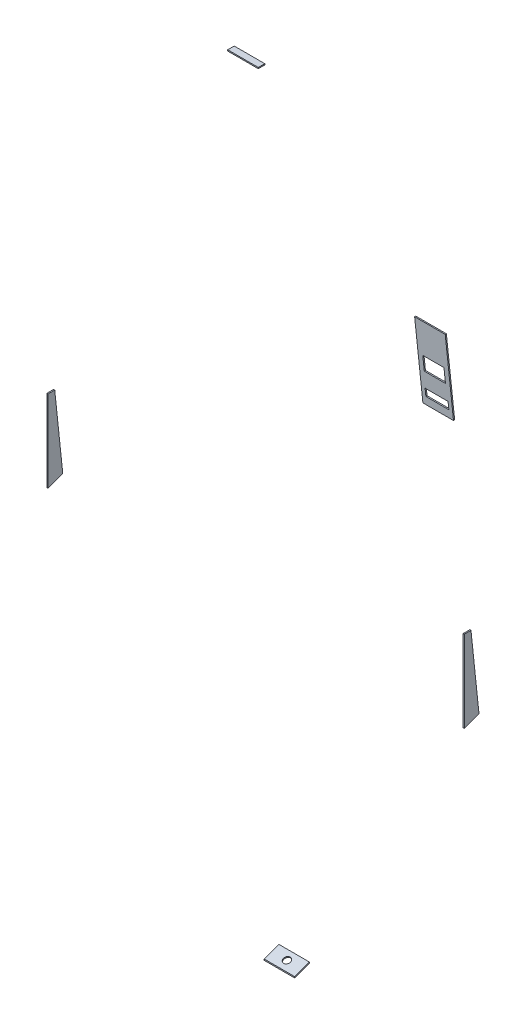
ISO-10303-21;
HEADER;
FILE_DESCRIPTION(('STEP AP214'),'2;1');
FILE_NAME('part.step','',(''),(''),'','','');
FILE_SCHEMA(('AUTOMOTIVE_DESIGN { 1 0 10303 214 1 1 1 1 }'));
ENDSEC;
DATA;
#1=APPLICATION_CONTEXT('core data for automotive mechanical design processes');
#2=APPLICATION_PROTOCOL_DEFINITION('international standard','automotive_design',2000,#1);
#3=PRODUCT_CONTEXT('',#1,'mechanical');
#4=PRODUCT('Part','Part','',(#3));
#5=PRODUCT_RELATED_PRODUCT_CATEGORY('part','',(#4));
#6=PRODUCT_DEFINITION_FORMATION('','',#4);
#7=PRODUCT_DEFINITION_CONTEXT('part definition',#1,'design');
#8=PRODUCT_DEFINITION('design','',#6,#7);
#9=PRODUCT_DEFINITION_SHAPE('','',#8);
#10=(LENGTH_UNIT() NAMED_UNIT(*) SI_UNIT(.MILLI.,.METRE.));
#11=(NAMED_UNIT(*) PLANE_ANGLE_UNIT() SI_UNIT($,.RADIAN.));
#12=(NAMED_UNIT(*) SI_UNIT($,.STERADIAN.) SOLID_ANGLE_UNIT());
#13=UNCERTAINTY_MEASURE_WITH_UNIT(LENGTH_MEASURE(1.E-05),#10,'distance_accuracy_value','');
#14=(GEOMETRIC_REPRESENTATION_CONTEXT(3) GLOBAL_UNCERTAINTY_ASSIGNED_CONTEXT((#13)) GLOBAL_UNIT_ASSIGNED_CONTEXT((#10,
#11,#12)) REPRESENTATION_CONTEXT('',''));
#15=CARTESIAN_POINT('',(0.,0.,0.));
#16=DIRECTION('',(0.,0.,1.));
#17=DIRECTION('',(1.,0.,0.));
#18=AXIS2_PLACEMENT_3D('',#15,#16,#17);
#19=CARTESIAN_POINT('',(62.794533111807,-6485.15366247084,-290.398414051492));
#20=DIRECTION('',(0.,0.939607059285866,0.342255130188236));
#21=DIRECTION('',(0.,-0.342255130188236,0.939607059285866));
#22=AXIS2_PLACEMENT_3D('',#19,#20,#21);
#23=PLANE('',#22);
#24=DIRECTION('',(0.,-0.342255130188232,0.939607059285868));
#25=VECTOR('',#24,1.);
#26=CARTESIAN_POINT('',(61.294533111807,-6485.15366247084,-290.398414051492));
#27=LINE('',#26,#25);
#28=CARTESIAN_POINT('',(61.294533111807,-6560.22169189386,-84.3110711568758));
#29=VERTEX_POINT('',#28);
#30=CARTESIAN_POINT('',(61.294533111807,-6567.19794008991,-65.1588905928039));
#31=VERTEX_POINT('',#30);
#32=EDGE_CURVE('E77',#29,#31,#27,.T.);
#33=ORIENTED_EDGE('',*,*,#32,.F.);
#34=DIRECTION('',(-1.,0.,0.));
#35=VECTOR('',#34,1.);
#36=CARTESIAN_POINT('',(62.794533111807,-6560.22169189386,-84.3110711568759));
#37=LINE('',#36,#35);
#38=CARTESIAN_POINT('',(62.794533111807,-6560.22169189386,-84.3110711568758));
#39=VERTEX_POINT('',#38);
#40=EDGE_CURVE('E85',#39,#29,#37,.T.);
#41=ORIENTED_EDGE('',*,*,#40,.F.);
#42=DIRECTION('',(0.,0.342255130188236,-0.939607059285866));
#43=VECTOR('',#42,1.);
#44=CARTESIAN_POINT('',(62.794533111807,-6485.15366247084,-290.398414051494));
#45=LINE('',#44,#43);
#46=CARTESIAN_POINT('',(62.794533111807,-6567.19794008991,-65.1588905928039));
#47=VERTEX_POINT('',#46);
#48=EDGE_CURVE('E177',#47,#39,#45,.T.);
#49=ORIENTED_EDGE('',*,*,#48,.F.);
#50=DIRECTION('',(1.,0.,0.));
#51=VECTOR('',#50,1.);
#52=CARTESIAN_POINT('',(62.794533111807,-6567.19794008991,-65.1588905928039));
#53=LINE('',#52,#51);
#54=EDGE_CURVE('E92',#31,#47,#53,.T.);
#55=ORIENTED_EDGE('',*,*,#54,.F.);
#56=EDGE_LOOP('',(#33,#41,#49,#55));
#57=FACE_BOUND('',#56,.T.);
#58=ADVANCED_FACE('F67',(#57),#23,.F.);
#59=CARTESIAN_POINT('',(62.794533111807,-6460.29435210617,-65.1588905928039));
#60=DIRECTION('',(0.,-1.,0.));
#61=DIRECTION('',(0.,0.,-1.));
#62=AXIS2_PLACEMENT_3D('',#59,#60,#61);
#63=PLANE('',#62);
#64=DIRECTION('',(0.,0.,1.));
#65=VECTOR('',#64,1.);
#66=CARTESIAN_POINT('',(61.294533111807,-6460.29435210617,-65.1588905928039));
#67=LINE('',#66,#65);
#68=CARTESIAN_POINT('',(61.294533111807,-6460.29435210617,-73.8082845263572));
#69=VERTEX_POINT('',#68);
#70=CARTESIAN_POINT('',(61.294533111807,-6460.29435210617,-65.1588905928039));
#71=VERTEX_POINT('',#70);
#72=EDGE_CURVE('E117',#69,#71,#67,.T.);
#73=ORIENTED_EDGE('',*,*,#72,.T.);
#74=DIRECTION('',(-1.,0.,0.));
#75=VECTOR('',#74,1.);
#76=CARTESIAN_POINT('',(62.794533111807,-6460.29435210617,-65.1588905928039));
#77=LINE('',#76,#75);
#78=CARTESIAN_POINT('',(62.794533111807,-6460.29435210617,-65.1588905928039));
#79=VERTEX_POINT('',#78);
#80=EDGE_CURVE('E174',#79,#71,#77,.T.);
#81=ORIENTED_EDGE('',*,*,#80,.F.);
#82=DIRECTION('',(0.,0.,1.));
#83=VECTOR('',#82,1.);
#84=CARTESIAN_POINT('',(62.794533111807,-6460.29435210617,-65.1588905928013));
#85=LINE('',#84,#83);
#86=CARTESIAN_POINT('',(62.794533111807,-6460.29435210617,-73.8082845263571));
#87=VERTEX_POINT('',#86);
#88=EDGE_CURVE('E119',#87,#79,#85,.T.);
#89=ORIENTED_EDGE('',*,*,#88,.F.);
#90=DIRECTION('',(1.,0.,0.));
#91=VECTOR('',#90,1.);
#92=CARTESIAN_POINT('',(62.794533111807,-6460.29435210617,-73.8082845263571));
#93=LINE('',#92,#91);
#94=EDGE_CURVE('E113',#69,#87,#93,.T.);
#95=ORIENTED_EDGE('',*,*,#94,.F.);
#96=EDGE_LOOP('',(#73,#81,#89,#95));
#97=FACE_BOUND('',#96,.T.);
#98=ADVANCED_FACE('F115',(#97),#63,.F.);
#99=CARTESIAN_POINT('',(62.794533111807,-5872.37989652977,-12.0159852713637));
#100=DIRECTION('',(0.,-0.104528463267654,0.994521895368273));
#101=DIRECTION('',(0.,-0.994521895368273,-0.104528463267654));
#102=AXIS2_PLACEMENT_3D('',#99,#100,#101);
#103=PLANE('',#102);
#104=DIRECTION('',(0.,0.994521895368273,0.104528463267654));
#105=VECTOR('',#104,1.);
#106=CARTESIAN_POINT('',(62.7945331118069,-5872.37989652977,-12.0159852713637));
#107=LINE('',#106,#105);
#108=EDGE_CURVE('E128',#39,#87,#107,.T.);
#109=ORIENTED_EDGE('',*,*,#108,.F.);
#110=ORIENTED_EDGE('',*,*,#40,.T.);
#111=DIRECTION('',(0.,-0.994521895368273,-0.104528463267654));
#112=VECTOR('',#111,1.);
#113=CARTESIAN_POINT('',(61.2945331118069,-5872.37989652977,-12.0159852713637));
#114=LINE('',#113,#112);
#115=EDGE_CURVE('E14',#69,#29,#114,.T.);
#116=ORIENTED_EDGE('',*,*,#115,.F.);
#117=ORIENTED_EDGE('',*,*,#94,.T.);
#118=EDGE_LOOP('',(#109,#110,#116,#117));
#119=FACE_BOUND('',#118,.T.);
#120=ADVANCED_FACE('F127',(#119),#103,.F.);
#121=CARTESIAN_POINT('',(62.794533111807,-5866.79435210617,-65.1588905928039));
#122=DIRECTION('',(0.,0.,-1.));
#123=DIRECTION('',(-1.,0.,0.));
#124=AXIS2_PLACEMENT_3D('',#121,#122,#123);
#125=PLANE('',#124);
#126=DIRECTION('',(0.,1.,0.));
#127=VECTOR('',#126,1.);
#128=CARTESIAN_POINT('',(61.2945331118069,-5866.79435210617,-65.1588905928039));
#129=LINE('',#128,#127);
#130=EDGE_CURVE('E125',#31,#71,#129,.T.);
#131=ORIENTED_EDGE('',*,*,#130,.F.);
#132=ORIENTED_EDGE('',*,*,#54,.T.);
#133=DIRECTION('',(0.,1.,0.));
#134=VECTOR('',#133,1.);
#135=CARTESIAN_POINT('',(62.794533111807,-6458.79435210617,-65.1588905928039));
#136=LINE('',#135,#134);
#137=EDGE_CURVE('E165',#47,#79,#136,.T.);
#138=ORIENTED_EDGE('',*,*,#137,.T.);
#139=ORIENTED_EDGE('',*,*,#80,.T.);
#140=EDGE_LOOP('',(#131,#132,#138,#139));
#141=FACE_BOUND('',#140,.T.);
#142=ADVANCED_FACE('F69',(#141),#125,.F.);
#143=CARTESIAN_POINT('',(62.7945331118069,-5866.79435210617,-65.1588905928039));
#144=DIRECTION('',(-1.,0.,0.));
#145=DIRECTION('',(0.,-1.,0.));
#146=AXIS2_PLACEMENT_3D('',#143,#144,#145);
#147=PLANE('',#146);
#148=ORIENTED_EDGE('',*,*,#137,.F.);
#149=ORIENTED_EDGE('',*,*,#48,.T.);
#150=ORIENTED_EDGE('',*,*,#108,.T.);
#151=ORIENTED_EDGE('',*,*,#88,.T.);
#152=EDGE_LOOP('',(#148,#149,#150,#151));
#153=FACE_BOUND('',#152,.T.);
#154=ADVANCED_FACE('F134',(#153),#147,.F.);
#155=CARTESIAN_POINT('',(61.2945331118069,-5866.79435210617,-65.1588905928039));
#156=DIRECTION('',(-1.,0.,0.));
#157=DIRECTION('',(0.,-1.,0.));
#158=AXIS2_PLACEMENT_3D('',#155,#156,#157);
#159=PLANE('',#158);
#160=ORIENTED_EDGE('',*,*,#72,.F.);
#161=ORIENTED_EDGE('',*,*,#115,.T.);
#162=ORIENTED_EDGE('',*,*,#32,.T.);
#163=ORIENTED_EDGE('',*,*,#130,.T.);
#164=EDGE_LOOP('',(#160,#161,#162,#163));
#165=FACE_BOUND('',#164,.T.);
#166=ADVANCED_FACE('F123',(#165),#159,.T.);
#167=CLOSED_SHELL('',(#58,#98,#120,#142,#154,#166));
#168=MANIFOLD_SOLID_BREP('B2',#167);
#169=CARTESIAN_POINT('',(-180.000000000001,-6897.80146093447,-311.401786417166));
#170=DIRECTION('',(0.,0.939607059285866,0.342255130188236));
#171=DIRECTION('',(0.,-0.342255130188236,0.939607059285866));
#172=AXIS2_PLACEMENT_3D('',#169,#170,#171);
#173=PLANE('',#172);
#174=DIRECTION('',(0.,0.342255130188236,-0.939607059285867));
#175=VECTOR('',#174,1.);
#176=CARTESIAN_POINT('',(-220.000000000002,-6897.80146093447,-311.401786417168));
#177=LINE('',#176,#175);
#178=CARTESIAN_POINT('',(-220.000000000002,-6979.84573855354,-86.1622629584782));
#179=VERTEX_POINT('',#178);
#180=CARTESIAN_POINT('',(-220.000000000002,-6972.86949035749,-105.31444352255));
#181=VERTEX_POINT('',#180);
#182=EDGE_CURVE('E304',#179,#181,#177,.T.);
#183=ORIENTED_EDGE('',*,*,#182,.F.);
#184=DIRECTION('',(1.,0.,0.));
#185=VECTOR('',#184,1.);
#186=CARTESIAN_POINT('',(-180.000000000001,-6979.84573855354,-86.1622629584782));
#187=LINE('',#186,#185);
#188=CARTESIAN_POINT('',(-180.000000000001,-6979.84573855354,-86.1622629584782));
#189=VERTEX_POINT('',#188);
#190=EDGE_CURVE('E294',#179,#189,#187,.T.);
#191=ORIENTED_EDGE('',*,*,#190,.T.);
#192=DIRECTION('',(0.,0.342255130188236,-0.939607059285866));
#193=VECTOR('',#192,1.);
#194=CARTESIAN_POINT('',(-180.000000000001,-6897.80146093447,-311.401786417168));
#195=LINE('',#194,#193);
#196=CARTESIAN_POINT('',(-180.000000000001,-6972.86949035749,-105.31444352255));
#197=VERTEX_POINT('',#196);
#198=EDGE_CURVE('E299',#189,#197,#195,.T.);
#199=ORIENTED_EDGE('',*,*,#198,.T.);
#200=DIRECTION('',(-1.,0.,0.));
#201=VECTOR('',#200,1.);
#202=CARTESIAN_POINT('',(-180.000000000001,-6972.86949035749,-105.31444352255));
#203=LINE('',#202,#201);
#204=EDGE_CURVE('E284',#197,#181,#203,.T.);
#205=ORIENTED_EDGE('',*,*,#204,.T.);
#206=EDGE_LOOP('',(#183,#191,#199,#205));
#207=FACE_BOUND('',#206,.T.);
#208=CARTESIAN_POINT('',(-200.000000000001,-6976.25061759233,-96.0320961214801));
#209=DIRECTION('',(0.,0.939607059285868,0.342255130188232));
#210=DIRECTION('',(0.,-0.342255130188232,0.939607059285868));
#211=AXIS2_PLACEMENT_3D('',#208,#209,#210);
#212=CIRCLE('',#211,4.49999999999996);
#213=CARTESIAN_POINT('',(-200.000000000001,-6977.79076567818,-91.8038643546937));
#214=VERTEX_POINT('',#213);
#215=EDGE_CURVE('E248',#214,#214,#212,.T.);
#216=ORIENTED_EDGE('',*,*,#215,.F.);
#217=EDGE_LOOP('',(#216));
#218=FACE_BOUND('',#217,.T.);
#219=ADVANCED_FACE('F237',(#207,#218),#173,.T.);
#220=CARTESIAN_POINT('',(-180.000000000001,-6285.0276949934,-33.019357637038));
#221=DIRECTION('',(0.,-0.104528463267654,0.994521895368273));
#222=DIRECTION('',(0.,-0.994521895368273,-0.104528463267654));
#223=AXIS2_PLACEMENT_3D('',#220,#221,#222);
#224=PLANE('',#223);
#225=ORIENTED_EDGE('',*,*,#204,.F.);
#226=DIRECTION('',(0.,0.994521895368273,0.104528463267654));
#227=VECTOR('',#226,1.);
#228=CARTESIAN_POINT('',(-180.000000000002,-6285.0276949934,-33.019357637038));
#229=LINE('',#228,#227);
#230=CARTESIAN_POINT('',(-180.000000000001,-6974.40703800442,-105.476046292165));
#231=VERTEX_POINT('',#230);
#232=EDGE_CURVE('E287',#231,#197,#229,.T.);
#233=ORIENTED_EDGE('',*,*,#232,.F.);
#234=DIRECTION('',(1.,0.,0.));
#235=VECTOR('',#234,1.);
#236=CARTESIAN_POINT('',(-180.000000000001,-6974.40703800442,-105.476046292166));
#237=LINE('',#236,#235);
#238=CARTESIAN_POINT('',(-220.000000000002,-6974.40703800442,-105.476046292165));
#239=VERTEX_POINT('',#238);
#240=EDGE_CURVE('E300',#239,#231,#237,.T.);
#241=ORIENTED_EDGE('',*,*,#240,.F.);
#242=DIRECTION('',(0.,0.994521895368274,0.104528463267654));
#243=VECTOR('',#242,1.);
#244=CARTESIAN_POINT('',(-220.000000000002,-6285.0276949934,-33.019357637038));
#245=LINE('',#244,#243);
#246=EDGE_CURVE('E289',#239,#181,#245,.T.);
#247=ORIENTED_EDGE('',*,*,#246,.T.);
#248=EDGE_LOOP('',(#225,#233,#241,#247));
#249=FACE_BOUND('',#248,.T.);
#250=ADVANCED_FACE('F286',(#249),#224,.F.);
#251=CARTESIAN_POINT('',(-180.000000000001,-6899.2108715234,-311.915169112448));
#252=DIRECTION('',(0.,0.939607059285868,0.342255130188232));
#253=DIRECTION('',(0.,-0.342255130188232,0.939607059285868));
#254=AXIS2_PLACEMENT_3D('',#251,#252,#253);
#255=PLANE('',#254);
#256=CARTESIAN_POINT('',(-200.000000000001,-6977.66002818126,-96.5454788167628));
#257=DIRECTION('',(0.,-0.939607059285866,-0.342255130188236));
#258=DIRECTION('',(0.,0.342255130188236,-0.939607059285866));
#259=AXIS2_PLACEMENT_3D('',#256,#257,#258);
#260=CIRCLE('',#259,4.49999999999996);
#261=CARTESIAN_POINT('',(-200.000000000001,-6976.11988009541,-100.773710583549));
#262=VERTEX_POINT('',#261);
#263=EDGE_CURVE('E65',#262,#262,#260,.T.);
#264=ORIENTED_EDGE('',*,*,#263,.F.);
#265=EDGE_LOOP('',(#264));
#266=FACE_BOUND('',#265,.T.);
#267=DIRECTION('',(0.,-0.342255130188232,0.939607059285868));
#268=VECTOR('',#267,1.);
#269=CARTESIAN_POINT('',(-220.000000000002,-6973.87790579273,-106.928694675047));
#270=LINE('',#269,#268);
#271=CARTESIAN_POINT('',(-220.000000000002,-6981.44215056979,-86.1622629584782));
#272=VERTEX_POINT('',#271);
#273=EDGE_CURVE('E444',#239,#272,#270,.T.);
#274=ORIENTED_EDGE('',*,*,#273,.F.);
#275=ORIENTED_EDGE('',*,*,#240,.T.);
#276=DIRECTION('',(0.,-0.342255130188232,0.939607059285868));
#277=VECTOR('',#276,1.);
#278=CARTESIAN_POINT('',(-180.000000000001,-6973.87790579273,-106.928694675047));
#279=LINE('',#278,#277);
#280=CARTESIAN_POINT('',(-180.000000000001,-6981.44215056979,-86.1622629584782));
#281=VERTEX_POINT('',#280);
#282=EDGE_CURVE('E265',#231,#281,#279,.T.);
#283=ORIENTED_EDGE('',*,*,#282,.T.);
#284=DIRECTION('',(1.,0.,0.));
#285=VECTOR('',#284,1.);
#286=CARTESIAN_POINT('',(-180.000000000001,-6981.44215056979,-86.1622629584782));
#287=LINE('',#286,#285);
#288=EDGE_CURVE('E318',#272,#281,#287,.T.);
#289=ORIENTED_EDGE('',*,*,#288,.F.);
#290=EDGE_LOOP('',(#274,#275,#283,#289));
#291=FACE_BOUND('',#290,.T.);
#292=ADVANCED_FACE('F342',(#266,#291),#255,.F.);
#293=CARTESIAN_POINT('',(-180.000000000001,-6279.44215056979,-86.1622629584782));
#294=DIRECTION('',(0.,0.,-1.));
#295=DIRECTION('',(-1.,0.,0.));
#296=AXIS2_PLACEMENT_3D('',#293,#294,#295);
#297=PLANE('',#296);
#298=ORIENTED_EDGE('',*,*,#190,.F.);
#299=DIRECTION('',(0.,-1.,0.));
#300=VECTOR('',#299,1.);
#301=CARTESIAN_POINT('',(-220.000000000002,-6871.44215056979,-86.1622629584782));
#302=LINE('',#301,#300);
#303=EDGE_CURVE('E256',#179,#272,#302,.T.);
#304=ORIENTED_EDGE('',*,*,#303,.T.);
#305=ORIENTED_EDGE('',*,*,#288,.T.);
#306=DIRECTION('',(0.,1.,0.));
#307=VECTOR('',#306,1.);
#308=CARTESIAN_POINT('',(-180.000000000001,-6871.44215056979,-86.1622629584782));
#309=LINE('',#308,#307);
#310=EDGE_CURVE('E242',#281,#189,#309,.T.);
#311=ORIENTED_EDGE('',*,*,#310,.T.);
#312=EDGE_LOOP('',(#298,#304,#305,#311));
#313=FACE_BOUND('',#312,.T.);
#314=ADVANCED_FACE('F333',(#313),#297,.F.);
#315=CARTESIAN_POINT('',(-180.000000000002,-6279.44215056979,-86.1622629584782));
#316=DIRECTION('',(-1.,0.,0.));
#317=DIRECTION('',(0.,-1.,0.));
#318=AXIS2_PLACEMENT_3D('',#315,#316,#317);
#319=PLANE('',#318);
#320=ORIENTED_EDGE('',*,*,#198,.F.);
#321=ORIENTED_EDGE('',*,*,#310,.F.);
#322=ORIENTED_EDGE('',*,*,#282,.F.);
#323=ORIENTED_EDGE('',*,*,#232,.T.);
#324=EDGE_LOOP('',(#320,#321,#322,#323));
#325=FACE_BOUND('',#324,.T.);
#326=ADVANCED_FACE('F239',(#325),#319,.F.);
#327=CARTESIAN_POINT('',(-220.000000000002,-6279.44215056979,-86.1622629584782));
#328=DIRECTION('',(-1.,0.,0.));
#329=DIRECTION('',(0.,0.,1.));
#330=AXIS2_PLACEMENT_3D('',#327,#328,#329);
#331=PLANE('',#330);
#332=ORIENTED_EDGE('',*,*,#303,.F.);
#333=ORIENTED_EDGE('',*,*,#182,.T.);
#334=ORIENTED_EDGE('',*,*,#246,.F.);
#335=ORIENTED_EDGE('',*,*,#273,.T.);
#336=EDGE_LOOP('',(#332,#333,#334,#335));
#337=FACE_BOUND('',#336,.T.);
#338=ADVANCED_FACE('F375',(#337),#331,.T.);
#339=CARTESIAN_POINT('',(-200.000000000001,-6972.96199288483,-94.8342031658216));
#340=DIRECTION('',(0.,-0.939607059285866,-0.342255130188236));
#341=DIRECTION('',(0.,0.342255130188236,-0.939607059285866));
#342=AXIS2_PLACEMENT_3D('',#339,#340,#341);
#343=CYLINDRICAL_SURFACE('',#342,4.49999999999996);
#344=ORIENTED_EDGE('',*,*,#215,.T.);
#345=EDGE_LOOP('',(#344));
#346=FACE_BOUND('',#345,.T.);
#347=ORIENTED_EDGE('',*,*,#263,.T.);
#348=EDGE_LOOP('',(#347));
#349=FACE_BOUND('',#348,.T.);
#350=ADVANCED_FACE('F373',(#346,#349),#343,.F.);
#351=CLOSED_SHELL('',(#219,#250,#292,#314,#326,#338,#350));
#352=MANIFOLD_SOLID_BREP('B8',#351);
#353=CARTESIAN_POINT('',(-442.82873265075,-6485.15366247084,-290.398414051491));
#354=DIRECTION('',(0.,0.939607059285866,0.342255130188236));
#355=DIRECTION('',(0.,-0.342255130188236,0.939607059285866));
#356=AXIS2_PLACEMENT_3D('',#353,#354,#355);
#357=PLANE('',#356);
#358=DIRECTION('',(0.,-0.342255130188232,0.939607059285868));
#359=VECTOR('',#358,1.);
#360=CARTESIAN_POINT('',(-481.32873265075,-6485.15366247084,-290.398414051491));
#361=LINE('',#360,#359);
#362=CARTESIAN_POINT('',(-481.32873265075,-6560.22169189386,-84.3110711568757));
#363=VERTEX_POINT('',#362);
#364=CARTESIAN_POINT('',(-481.32873265075,-6567.19794008991,-65.1588905928038));
#365=VERTEX_POINT('',#364);
#366=EDGE_CURVE('E491',#363,#365,#361,.T.);
#367=ORIENTED_EDGE('',*,*,#366,.T.);
#368=DIRECTION('',(1.,0.,0.));
#369=VECTOR('',#368,1.);
#370=CARTESIAN_POINT('',(-442.82873265075,-6567.19794008991,-65.1588905928038));
#371=LINE('',#370,#369);
#372=CARTESIAN_POINT('',(-482.82873265075,-6567.19794008991,-65.1588905928038));
#373=VERTEX_POINT('',#372);
#374=EDGE_CURVE('E589',#373,#365,#371,.T.);
#375=ORIENTED_EDGE('',*,*,#374,.F.);
#376=DIRECTION('',(0.,0.342255130188236,-0.939607059285867));
#377=VECTOR('',#376,1.);
#378=CARTESIAN_POINT('',(-482.82873265075,-6485.15366247084,-290.398414051494));
#379=LINE('',#378,#377);
#380=CARTESIAN_POINT('',(-482.82873265075,-6560.22169189386,-84.3110711568757));
#381=VERTEX_POINT('',#380);
#382=EDGE_CURVE('E536',#373,#381,#379,.T.);
#383=ORIENTED_EDGE('',*,*,#382,.T.);
#384=DIRECTION('',(-1.,0.,0.));
#385=VECTOR('',#384,1.);
#386=CARTESIAN_POINT('',(-442.82873265075,-6560.22169189386,-84.3110711568757));
#387=LINE('',#386,#385);
#388=EDGE_CURVE('E532',#363,#381,#387,.T.);
#389=ORIENTED_EDGE('',*,*,#388,.F.);
#390=EDGE_LOOP('',(#367,#375,#383,#389));
#391=FACE_BOUND('',#390,.T.);
#392=ADVANCED_FACE('F486',(#391),#357,.F.);
#393=CARTESIAN_POINT('',(-442.82873265075,-6460.29435210617,-65.1588905928038));
#394=DIRECTION('',(0.,-1.,0.));
#395=DIRECTION('',(0.,0.,-1.));
#396=AXIS2_PLACEMENT_3D('',#393,#394,#395);
#397=PLANE('',#396);
#398=DIRECTION('',(0.,0.,1.));
#399=VECTOR('',#398,1.);
#400=CARTESIAN_POINT('',(-481.32873265075,-6460.29435210617,-65.1588905928038));
#401=LINE('',#400,#399);
#402=CARTESIAN_POINT('',(-481.32873265075,-6460.29435210617,-73.808284526357));
#403=VERTEX_POINT('',#402);
#404=CARTESIAN_POINT('',(-481.32873265075,-6460.29435210617,-65.1588905928038));
#405=VERTEX_POINT('',#404);
#406=EDGE_CURVE('E496',#403,#405,#401,.T.);
#407=ORIENTED_EDGE('',*,*,#406,.F.);
#408=DIRECTION('',(1.,0.,0.));
#409=VECTOR('',#408,1.);
#410=CARTESIAN_POINT('',(-442.82873265075,-6460.29435210617,-73.808284526357));
#411=LINE('',#410,#409);
#412=CARTESIAN_POINT('',(-482.82873265075,-6460.29435210617,-73.808284526357));
#413=VERTEX_POINT('',#412);
#414=EDGE_CURVE('E504',#413,#403,#411,.T.);
#415=ORIENTED_EDGE('',*,*,#414,.F.);
#416=DIRECTION('',(0.,0.,1.));
#417=VECTOR('',#416,1.);
#418=CARTESIAN_POINT('',(-482.82873265075,-6460.29435210617,-65.1588905928012));
#419=LINE('',#418,#417);
#420=CARTESIAN_POINT('',(-482.82873265075,-6460.29435210617,-65.1588905928038));
#421=VERTEX_POINT('',#420);
#422=EDGE_CURVE('E543',#413,#421,#419,.T.);
#423=ORIENTED_EDGE('',*,*,#422,.T.);
#424=DIRECTION('',(-1.,0.,0.));
#425=VECTOR('',#424,1.);
#426=CARTESIAN_POINT('',(-442.82873265075,-6460.29435210617,-65.1588905928038));
#427=LINE('',#426,#425);
#428=EDGE_CURVE('E511',#405,#421,#427,.T.);
#429=ORIENTED_EDGE('',*,*,#428,.F.);
#430=EDGE_LOOP('',(#407,#415,#423,#429));
#431=FACE_BOUND('',#430,.T.);
#432=ADVANCED_FACE('F546',(#431),#397,.F.);
#433=CARTESIAN_POINT('',(-442.82873265075,-5872.37989652977,-12.0159852713635));
#434=DIRECTION('',(0.,-0.104528463267654,0.994521895368273));
#435=DIRECTION('',(0.,-0.994521895368273,-0.104528463267654));
#436=AXIS2_PLACEMENT_3D('',#433,#434,#435);
#437=PLANE('',#436);
#438=DIRECTION('',(0.,0.994521895368274,0.104528463267654));
#439=VECTOR('',#438,1.);
#440=CARTESIAN_POINT('',(-481.32873265075,-5872.37989652977,-12.0159852713636));
#441=LINE('',#440,#439);
#442=EDGE_CURVE('E235',#363,#403,#441,.T.);
#443=ORIENTED_EDGE('',*,*,#442,.F.);
#444=ORIENTED_EDGE('',*,*,#388,.T.);
#445=DIRECTION('',(0.,0.994521895368274,0.104528463267654));
#446=VECTOR('',#445,1.);
#447=CARTESIAN_POINT('',(-482.82873265075,-5872.37989652977,-12.0159852713635));
#448=LINE('',#447,#446);
#449=EDGE_CURVE('E571',#381,#413,#448,.T.);
#450=ORIENTED_EDGE('',*,*,#449,.T.);
#451=ORIENTED_EDGE('',*,*,#414,.T.);
#452=EDGE_LOOP('',(#443,#444,#450,#451));
#453=FACE_BOUND('',#452,.T.);
#454=ADVANCED_FACE('F544',(#453),#437,.F.);
#455=CARTESIAN_POINT('',(-442.82873265075,-5866.79435210617,-65.1588905928038));
#456=DIRECTION('',(0.,0.,-1.));
#457=DIRECTION('',(-1.,0.,0.));
#458=AXIS2_PLACEMENT_3D('',#455,#456,#457);
#459=PLANE('',#458);
#460=DIRECTION('',(0.,-1.,0.));
#461=VECTOR('',#460,1.);
#462=CARTESIAN_POINT('',(-482.82873265075,-6458.79435210617,-65.1588905928038));
#463=LINE('',#462,#461);
#464=EDGE_CURVE('E583',#421,#373,#463,.T.);
#465=ORIENTED_EDGE('',*,*,#464,.T.);
#466=ORIENTED_EDGE('',*,*,#374,.T.);
#467=DIRECTION('',(0.,-1.,0.));
#468=VECTOR('',#467,1.);
#469=CARTESIAN_POINT('',(-481.32873265075,-5866.79435210617,-65.1588905928038));
#470=LINE('',#469,#468);
#471=EDGE_CURVE('E542',#405,#365,#470,.T.);
#472=ORIENTED_EDGE('',*,*,#471,.F.);
#473=ORIENTED_EDGE('',*,*,#428,.T.);
#474=EDGE_LOOP('',(#465,#466,#472,#473));
#475=FACE_BOUND('',#474,.T.);
#476=ADVANCED_FACE('F488',(#475),#459,.F.);
#477=CARTESIAN_POINT('',(-482.82873265075,-5866.79435210617,-65.1588905928038));
#478=DIRECTION('',(-1.,0.,0.));
#479=DIRECTION('',(0.,0.,1.));
#480=AXIS2_PLACEMENT_3D('',#477,#478,#479);
#481=PLANE('',#480);
#482=ORIENTED_EDGE('',*,*,#382,.F.);
#483=ORIENTED_EDGE('',*,*,#464,.F.);
#484=ORIENTED_EDGE('',*,*,#422,.F.);
#485=ORIENTED_EDGE('',*,*,#449,.F.);
#486=EDGE_LOOP('',(#482,#483,#484,#485));
#487=FACE_BOUND('',#486,.T.);
#488=ADVANCED_FACE('F552',(#487),#481,.T.);
#489=CARTESIAN_POINT('',(-481.32873265075,-5866.79435210617,-65.1588905928038));
#490=DIRECTION('',(-1.,0.,0.));
#491=DIRECTION('',(0.,0.,1.));
#492=AXIS2_PLACEMENT_3D('',#489,#490,#491);
#493=PLANE('',#492);
#494=ORIENTED_EDGE('',*,*,#366,.F.);
#495=ORIENTED_EDGE('',*,*,#442,.T.);
#496=ORIENTED_EDGE('',*,*,#406,.T.);
#497=ORIENTED_EDGE('',*,*,#471,.T.);
#498=EDGE_LOOP('',(#494,#495,#496,#497));
#499=FACE_BOUND('',#498,.T.);
#500=ADVANCED_FACE('F540',(#499),#493,.F.);
#501=CLOSED_SHELL('',(#392,#432,#454,#476,#488,#500));
#502=MANIFOLD_SOLID_BREP('B59',#501);
#503=CARTESIAN_POINT('',(-180.000000000009,-5334.77069447946,-38.5686334456869));
#504=DIRECTION('',(0.,0.,-1.));
#505=DIRECTION('',(-1.,0.,0.));
#506=AXIS2_PLACEMENT_3D('',#503,#504,#505);
#507=PLANE('',#506);
#508=DIRECTION('',(-1.,0.,0.));
#509=VECTOR('',#508,1.);
#510=CARTESIAN_POINT('',(-180.000000000009,-5928.27069447945,-38.5686334456869));
#511=LINE('',#510,#509);
#512=CARTESIAN_POINT('',(-180.000000000009,-5928.27069447945,-38.5686334456869));
#513=VERTEX_POINT('',#512);
#514=CARTESIAN_POINT('',(-220.000000000009,-5928.27069447945,-38.5686334456869));
#515=VERTEX_POINT('',#514);
#516=EDGE_CURVE('E680',#513,#515,#511,.T.);
#517=ORIENTED_EDGE('',*,*,#516,.F.);
#518=DIRECTION('',(0.,1.,0.));
#519=VECTOR('',#518,1.);
#520=CARTESIAN_POINT('',(-180.000000000009,-5926.77069447945,-38.5686334456869));
#521=LINE('',#520,#519);
#522=CARTESIAN_POINT('',(-180.000000000009,-5926.77069447945,-38.5686334456869));
#523=VERTEX_POINT('',#522);
#524=EDGE_CURVE('E697',#513,#523,#521,.T.);
#525=ORIENTED_EDGE('',*,*,#524,.T.);
#526=DIRECTION('',(-1.,0.,0.));
#527=VECTOR('',#526,1.);
#528=CARTESIAN_POINT('',(-180.000000000009,-5926.77069447945,-38.5686334456869));
#529=LINE('',#528,#527);
#530=CARTESIAN_POINT('',(-220.000000000009,-5926.77069447945,-38.5686334456869));
#531=VERTEX_POINT('',#530);
#532=EDGE_CURVE('E659',#523,#531,#529,.T.);
#533=ORIENTED_EDGE('',*,*,#532,.T.);
#534=DIRECTION('',(0.,-1.,0.));
#535=VECTOR('',#534,1.);
#536=CARTESIAN_POINT('',(-220.000000000009,-5926.77069447945,-38.5686334456869));
#537=LINE('',#536,#535);
#538=EDGE_CURVE('E706',#531,#515,#537,.T.);
#539=ORIENTED_EDGE('',*,*,#538,.T.);
#540=EDGE_LOOP('',(#517,#525,#533,#539));
#541=FACE_BOUND('',#540,.T.);
#542=ADVANCED_FACE('F655',(#541),#507,.F.);
#543=CARTESIAN_POINT('',(-180.000000000009,-5926.77069447945,-38.5686334456869));
#544=DIRECTION('',(0.,-1.,0.));
#545=DIRECTION('',(0.,0.,-1.));
#546=AXIS2_PLACEMENT_3D('',#543,#544,#545);
#547=PLANE('',#546);
#548=DIRECTION('',(0.,0.,1.));
#549=VECTOR('',#548,1.);
#550=CARTESIAN_POINT('',(-180.000000000009,-5926.77069447945,-48.5686334456869));
#551=LINE('',#550,#549);
#552=CARTESIAN_POINT('',(-180.000000000009,-5926.77069447945,-47.0603710263416));
#553=VERTEX_POINT('',#552);
#554=EDGE_CURVE('E711',#553,#523,#551,.T.);
#555=ORIENTED_EDGE('',*,*,#554,.F.);
#556=DIRECTION('',(-1.,0.,0.));
#557=VECTOR('',#556,1.);
#558=CARTESIAN_POINT('',(-180.000000000009,-5926.77069447945,-47.0603710263416));
#559=LINE('',#558,#557);
#560=CARTESIAN_POINT('',(-220.000000000009,-5926.77069447945,-47.0603710263416));
#561=VERTEX_POINT('',#560);
#562=EDGE_CURVE('E721',#553,#561,#559,.T.);
#563=ORIENTED_EDGE('',*,*,#562,.T.);
#564=DIRECTION('',(0.,0.,1.));
#565=VECTOR('',#564,1.);
#566=CARTESIAN_POINT('',(-220.000000000009,-5926.77069447945,-48.5686334456869));
#567=LINE('',#566,#565);
#568=EDGE_CURVE('E707',#561,#531,#567,.T.);
#569=ORIENTED_EDGE('',*,*,#568,.T.);
#570=ORIENTED_EDGE('',*,*,#532,.F.);
#571=EDGE_LOOP('',(#555,#563,#569,#570));
#572=FACE_BOUND('',#571,.T.);
#573=ADVANCED_FACE('F719',(#572),#547,.F.);
#574=CARTESIAN_POINT('',(-180.000000000009,-5340.35623890306,14.5742718757533));
#575=DIRECTION('',(0.,-0.104528463267654,0.994521895368273));
#576=DIRECTION('',(0.,-0.994521895368273,-0.104528463267654));
#577=AXIS2_PLACEMENT_3D('',#574,#575,#576);
#578=PLANE('',#577);
#579=DIRECTION('',(1.,0.,0.));
#580=VECTOR('',#579,1.);
#581=CARTESIAN_POINT('',(-180.000000000009,-5928.27069447945,-47.2180273792401));
#582=LINE('',#581,#580);
#583=CARTESIAN_POINT('',(-220.000000000009,-5928.27069447945,-47.2180273792401));
#584=VERTEX_POINT('',#583);
#585=CARTESIAN_POINT('',(-180.000000000009,-5928.27069447945,-47.2180273792401));
#586=VERTEX_POINT('',#585);
#587=EDGE_CURVE('E672',#584,#586,#582,.T.);
#588=ORIENTED_EDGE('',*,*,#587,.F.);
#589=DIRECTION('',(0.,0.994521895368274,0.104528463267654));
#590=VECTOR('',#589,1.);
#591=CARTESIAN_POINT('',(-220.000000000009,-5340.35623890306,14.5742718757533));
#592=LINE('',#591,#590);
#593=EDGE_CURVE('E792',#584,#561,#592,.T.);
#594=ORIENTED_EDGE('',*,*,#593,.T.);
#595=ORIENTED_EDGE('',*,*,#562,.F.);
#596=DIRECTION('',(0.,0.994521895368273,0.104528463267654));
#597=VECTOR('',#596,1.);
#598=CARTESIAN_POINT('',(-180.000000000009,-5340.35623890306,14.5742718757533));
#599=LINE('',#598,#597);
#600=EDGE_CURVE('E713',#586,#553,#599,.T.);
#601=ORIENTED_EDGE('',*,*,#600,.F.);
#602=EDGE_LOOP('',(#588,#594,#595,#601));
#603=FACE_BOUND('',#602,.T.);
#604=ADVANCED_FACE('F657',(#603),#578,.F.);
#605=CARTESIAN_POINT('',(-180.000000000009,-5334.77069447946,-38.5686334456869));
#606=DIRECTION('',(-1.,0.,0.));
#607=DIRECTION('',(0.,-1.,0.));
#608=AXIS2_PLACEMENT_3D('',#605,#606,#607);
#609=PLANE('',#608);
#610=DIRECTION('',(0.,0.,1.));
#611=VECTOR('',#610,1.);
#612=CARTESIAN_POINT('',(-180.000000000009,-5928.27069447945,-38.5686334456843));
#613=LINE('',#612,#611);
#614=EDGE_CURVE('E484',#586,#513,#613,.T.);
#615=ORIENTED_EDGE('',*,*,#614,.F.);
#616=ORIENTED_EDGE('',*,*,#600,.T.);
#617=ORIENTED_EDGE('',*,*,#554,.T.);
#618=ORIENTED_EDGE('',*,*,#524,.F.);
#619=EDGE_LOOP('',(#615,#616,#617,#618));
#620=FACE_BOUND('',#619,.T.);
#621=ADVANCED_FACE('F712',(#620),#609,.F.);
#622=CARTESIAN_POINT('',(-220.000000000009,-5334.77069447946,-38.5686334456869));
#623=DIRECTION('',(-1.,0.,0.));
#624=DIRECTION('',(0.,0.,1.));
#625=AXIS2_PLACEMENT_3D('',#622,#623,#624);
#626=PLANE('',#625);
#627=ORIENTED_EDGE('',*,*,#593,.F.);
#628=DIRECTION('',(0.,0.,1.));
#629=VECTOR('',#628,1.);
#630=CARTESIAN_POINT('',(-220.000000000009,-5928.27069447945,-38.5686334456843));
#631=LINE('',#630,#629);
#632=EDGE_CURVE('E665',#584,#515,#631,.T.);
#633=ORIENTED_EDGE('',*,*,#632,.T.);
#634=ORIENTED_EDGE('',*,*,#538,.F.);
#635=ORIENTED_EDGE('',*,*,#568,.F.);
#636=EDGE_LOOP('',(#627,#633,#634,#635));
#637=FACE_BOUND('',#636,.T.);
#638=ADVANCED_FACE('F798',(#637),#626,.T.);
#639=CARTESIAN_POINT('',(-180.000000000009,-5928.27069447945,-38.5686334456869));
#640=DIRECTION('',(0.,-1.,0.));
#641=DIRECTION('',(0.,0.,-1.));
#642=AXIS2_PLACEMENT_3D('',#639,#640,#641);
#643=PLANE('',#642);
#644=ORIENTED_EDGE('',*,*,#516,.T.);
#645=ORIENTED_EDGE('',*,*,#632,.F.);
#646=ORIENTED_EDGE('',*,*,#587,.T.);
#647=ORIENTED_EDGE('',*,*,#614,.T.);
#648=EDGE_LOOP('',(#644,#645,#646,#647));
#649=FACE_BOUND('',#648,.T.);
#650=ADVANCED_FACE('F800',(#649),#643,.T.);
#651=CLOSED_SHELL('',(#542,#573,#604,#621,#638,#650));
#652=MANIFOLD_SOLID_BREP('B229',#651);
#653=CARTESIAN_POINT('',(-180.,-5764.77289665173,-221.287814382056));
#654=DIRECTION('',(0.,-0.104528463267654,0.994521895368273));
#655=DIRECTION('',(0.,-0.994521895368273,-0.104528463267654));
#656=AXIS2_PLACEMENT_3D('',#653,#654,#655);
#657=PLANE('',#656);
#658=DIRECTION('',(0.,0.994521895368274,0.104528463267654));
#659=VECTOR('',#658,1.);
#660=CARTESIAN_POINT('',(-220.,-5764.77289665173,-221.287814382056));
#661=LINE('',#660,#659);
#662=CARTESIAN_POINT('',(-220.,-6454.15223966275,-293.744503037183));
#663=VERTEX_POINT('',#662);
#664=CARTESIAN_POINT('',(-220.,-6351.18735222813,-282.922457284151));
#665=VERTEX_POINT('',#664);
#666=EDGE_CURVE('E979',#663,#665,#661,.T.);
#667=ORIENTED_EDGE('',*,*,#666,.F.);
#668=DIRECTION('',(1.,0.,0.));
#669=VECTOR('',#668,1.);
#670=CARTESIAN_POINT('',(-180.,-6454.15223966275,-293.744503037183));
#671=LINE('',#670,#669);
#672=CARTESIAN_POINT('',(-180.,-6454.15223966275,-293.744503037183));
#673=VERTEX_POINT('',#672);
#674=EDGE_CURVE('E989',#663,#673,#671,.T.);
#675=ORIENTED_EDGE('',*,*,#674,.T.);
#676=DIRECTION('',(0.,0.994521895368273,0.104528463267654));
#677=VECTOR('',#676,1.);
#678=CARTESIAN_POINT('',(-180.,-5764.77289665173,-221.287814382056));
#679=LINE('',#678,#677);
#680=CARTESIAN_POINT('',(-180.,-6351.18735222813,-282.922457284151));
#681=VERTEX_POINT('',#680);
#682=EDGE_CURVE('E993',#673,#681,#679,.T.);
#683=ORIENTED_EDGE('',*,*,#682,.T.);
#684=DIRECTION('',(-1.,0.,0.));
#685=VECTOR('',#684,1.);
#686=CARTESIAN_POINT('',(-180.,-6351.18735222813,-282.922457284151));
#687=LINE('',#686,#685);
#688=EDGE_CURVE('E972',#681,#665,#687,.T.);
#689=ORIENTED_EDGE('',*,*,#688,.T.);
#690=EDGE_LOOP('',(#667,#675,#683,#689));
#691=FACE_BOUND('',#690,.T.);
#692=DIRECTION('',(-1.,0.,0.));
#693=VECTOR('',#692,1.);
#694=CARTESIAN_POINT('',(-180.,-6443.83468119228,-292.660083944335));
#695=LINE('',#694,#693);
#696=CARTESIAN_POINT('',(-185.,-6443.83468119228,-292.660083944335));
#697=VERTEX_POINT('',#696);
#698=CARTESIAN_POINT('',(-215.,-6443.83468119228,-292.660083944335));
#699=VERTEX_POINT('',#698);
#700=EDGE_CURVE('E1076',#697,#699,#695,.T.);
#701=ORIENTED_EDGE('',*,*,#700,.T.);
#702=DIRECTION('',(0.,0.994521895368273,0.104528463267654));
#703=VECTOR('',#702,1.);
#704=CARTESIAN_POINT('',(-215.,-5764.77289665173,-221.287814382056));
#705=LINE('',#704,#703);
#706=CARTESIAN_POINT('',(-215.,-6433.8894622386,-291.614799311659));
#707=VERTEX_POINT('',#706);
#708=EDGE_CURVE('E909',#699,#707,#705,.T.);
#709=ORIENTED_EDGE('',*,*,#708,.T.);
#710=DIRECTION('',(-1.,0.,0.));
#711=VECTOR('',#710,1.);
#712=CARTESIAN_POINT('',(-180.,-6433.8894622386,-291.614799311659));
#713=LINE('',#712,#711);
#714=CARTESIAN_POINT('',(-185.,-6433.8894622386,-291.614799311659));
#715=VERTEX_POINT('',#714);
#716=EDGE_CURVE('E905',#715,#707,#713,.T.);
#717=ORIENTED_EDGE('',*,*,#716,.F.);
#718=DIRECTION('',(0.,0.994521895368273,0.104528463267654));
#719=VECTOR('',#718,1.);
#720=CARTESIAN_POINT('',(-185.,-5764.77289665173,-221.287814382056));
#721=LINE('',#720,#719);
#722=EDGE_CURVE('E1044',#697,#715,#721,.T.);
#723=ORIENTED_EDGE('',*,*,#722,.F.);
#724=EDGE_LOOP('',(#701,#709,#717,#723));
#725=FACE_BOUND('',#724,.T.);
#726=DIRECTION('',(0.,-0.994521895368273,-0.104528463267654));
#727=VECTOR('',#726,1.);
#728=CARTESIAN_POINT('',(-186.15,-5764.77289665173,-221.287814382056));
#729=LINE('',#728,#727);
#730=CARTESIAN_POINT('',(-186.15,-6394.10858642386,-287.433660780953));
#731=VERTEX_POINT('',#730);
#732=CARTESIAN_POINT('',(-186.15,-6413.00450243586,-289.419701583038));
#733=VERTEX_POINT('',#732);
#734=EDGE_CURVE('E653',#731,#733,#729,.T.);
#735=ORIENTED_EDGE('',*,*,#734,.T.);
#736=DIRECTION('',(-1.,0.,0.));
#737=VECTOR('',#736,1.);
#738=CARTESIAN_POINT('',(-180.,-6413.00450243586,-289.419701583038));
#739=LINE('',#738,#737);
#740=CARTESIAN_POINT('',(-213.85,-6413.00450243586,-289.419701583038));
#741=VERTEX_POINT('',#740);
#742=EDGE_CURVE('E884',#733,#741,#739,.T.);
#743=ORIENTED_EDGE('',*,*,#742,.T.);
#744=DIRECTION('',(0.,-0.994521895368273,-0.104528463267654));
#745=VECTOR('',#744,1.);
#746=CARTESIAN_POINT('',(-213.85,-5764.77289665173,-221.287814382056));
#747=LINE('',#746,#745);
#748=CARTESIAN_POINT('',(-213.85,-6394.10858642386,-287.433660780953));
#749=VERTEX_POINT('',#748);
#750=EDGE_CURVE('E912',#749,#741,#747,.T.);
#751=ORIENTED_EDGE('',*,*,#750,.F.);
#752=DIRECTION('',(-1.,0.,0.));
#753=VECTOR('',#752,1.);
#754=CARTESIAN_POINT('',(-180.,-6394.10858642386,-287.433660780953));
#755=LINE('',#754,#753);
#756=EDGE_CURVE('E1073',#731,#749,#755,.T.);
#757=ORIENTED_EDGE('',*,*,#756,.F.);
#758=EDGE_LOOP('',(#735,#743,#751,#757));
#759=FACE_BOUND('',#758,.T.);
#760=ADVANCED_FACE('F871',(#691,#725,#759),#657,.T.);
#761=CARTESIAN_POINT('',(-180.,-6378.95607318173,-500.183625857466));
#762=DIRECTION('',(0.,0.939607059285868,0.342255130188232));
#763=DIRECTION('',(0.,-0.342255130188232,0.939607059285868));
#764=AXIS2_PLACEMENT_3D('',#761,#762,#763);
#765=PLANE('',#764);
#766=ORIENTED_EDGE('',*,*,#674,.F.);
#767=DIRECTION('',(0.,-0.342255130188232,0.939607059285868));
#768=VECTOR('',#767,1.);
#769=CARTESIAN_POINT('',(-220.,-6453.62310745106,-295.197151420064));
#770=LINE('',#769,#768);
#771=CARTESIAN_POINT('',(-220.,-6453.62310745106,-295.197151420064));
#772=VERTEX_POINT('',#771);
#773=EDGE_CURVE('E984',#772,#663,#770,.T.);
#774=ORIENTED_EDGE('',*,*,#773,.F.);
#775=DIRECTION('',(-1.,0.,0.));
#776=VECTOR('',#775,1.);
#777=CARTESIAN_POINT('',(-180.,-6453.62310745106,-295.197151420064));
#778=LINE('',#777,#776);
#779=CARTESIAN_POINT('',(-180.,-6453.62310745106,-295.197151420064));
#780=VERTEX_POINT('',#779);
#781=EDGE_CURVE('E876',#780,#772,#778,.T.);
#782=ORIENTED_EDGE('',*,*,#781,.F.);
#783=DIRECTION('',(0.,-0.342255130188232,0.939607059285868));
#784=VECTOR('',#783,1.);
#785=CARTESIAN_POINT('',(-180.,-6453.62310745106,-295.197151420064));
#786=LINE('',#785,#784);
#787=EDGE_CURVE('E1094',#780,#673,#786,.T.);
#788=ORIENTED_EDGE('',*,*,#787,.T.);
#789=EDGE_LOOP('',(#766,#774,#782,#788));
#790=FACE_BOUND('',#789,.T.);
#791=ADVANCED_FACE('F1118',(#790),#765,.F.);
#792=CARTESIAN_POINT('',(-220.,-5759.18735222813,-274.430719703496));
#793=DIRECTION('',(-1.,0.,0.));
#794=DIRECTION('',(0.,0.,1.));
#795=AXIS2_PLACEMENT_3D('',#792,#793,#794);
#796=PLANE('',#795);
#797=ORIENTED_EDGE('',*,*,#773,.T.);
#798=ORIENTED_EDGE('',*,*,#666,.T.);
#799=DIRECTION('',(0.,0.,1.));
#800=VECTOR('',#799,1.);
#801=CARTESIAN_POINT('',(-220.,-6351.18735222813,-284.430719703496));
#802=LINE('',#801,#800);
#803=CARTESIAN_POINT('',(-220.,-6351.18735222813,-284.430719703496));
#804=VERTEX_POINT('',#803);
#805=EDGE_CURVE('E968',#804,#665,#802,.T.);
#806=ORIENTED_EDGE('',*,*,#805,.F.);
#807=DIRECTION('',(0.,0.994521895368273,0.104528463267654));
#808=VECTOR('',#807,1.);
#809=CARTESIAN_POINT('',(-220.,-6351.18735222813,-284.430719703496));
#810=LINE('',#809,#808);
#811=EDGE_CURVE('E1144',#772,#804,#810,.T.);
#812=ORIENTED_EDGE('',*,*,#811,.F.);
#813=EDGE_LOOP('',(#797,#798,#806,#812));
#814=FACE_BOUND('',#813,.T.);
#815=ADVANCED_FACE('F982',(#814),#796,.T.);
#816=CARTESIAN_POINT('',(-180.,-5759.18735222813,-274.430719703496));
#817=DIRECTION('',(-1.,0.,0.));
#818=DIRECTION('',(0.,-1.,0.));
#819=AXIS2_PLACEMENT_3D('',#816,#817,#818);
#820=PLANE('',#819);
#821=ORIENTED_EDGE('',*,*,#682,.F.);
#822=ORIENTED_EDGE('',*,*,#787,.F.);
#823=DIRECTION('',(0.,-0.994521895368273,-0.104528463267654));
#824=VECTOR('',#823,1.);
#825=CARTESIAN_POINT('',(-180.,-6351.18735222813,-284.430719703496));
#826=LINE('',#825,#824);
#827=CARTESIAN_POINT('',(-180.,-6351.18735222813,-284.430719703496));
#828=VERTEX_POINT('',#827);
#829=EDGE_CURVE('E1058',#828,#780,#826,.T.);
#830=ORIENTED_EDGE('',*,*,#829,.F.);
#831=DIRECTION('',(0.,0.,1.));
#832=VECTOR('',#831,1.);
#833=CARTESIAN_POINT('',(-180.,-6351.18735222813,-284.430719703496));
#834=LINE('',#833,#832);
#835=EDGE_CURVE('E978',#828,#681,#834,.T.);
#836=ORIENTED_EDGE('',*,*,#835,.T.);
#837=EDGE_LOOP('',(#821,#822,#830,#836));
#838=FACE_BOUND('',#837,.T.);
#839=ADVANCED_FACE('F1092',(#838),#820,.F.);
#840=CARTESIAN_POINT('',(-180.,-6351.18735222813,-274.430719703496));
#841=DIRECTION('',(0.,-1.,0.));
#842=DIRECTION('',(0.,0.,-1.));
#843=AXIS2_PLACEMENT_3D('',#840,#841,#842);
#844=PLANE('',#843);
#845=ORIENTED_EDGE('',*,*,#688,.F.);
#846=ORIENTED_EDGE('',*,*,#835,.F.);
#847=DIRECTION('',(1.,0.,0.));
#848=VECTOR('',#847,1.);
#849=CARTESIAN_POINT('',(-180.,-6351.18735222813,-284.430719703496));
#850=LINE('',#849,#848);
#851=EDGE_CURVE('E973',#804,#828,#850,.T.);
#852=ORIENTED_EDGE('',*,*,#851,.F.);
#853=ORIENTED_EDGE('',*,*,#805,.T.);
#854=EDGE_LOOP('',(#845,#846,#852,#853));
#855=FACE_BOUND('',#854,.T.);
#856=ADVANCED_FACE('F873',(#855),#844,.F.);
#857=CARTESIAN_POINT('',(-186.15,-6394.4744360453,-283.952834147164));
#858=DIRECTION('',(0.,-0.994521895368273,-0.104528463267654));
#859=DIRECTION('',(0.,0.104528463267654,-0.994521895368273));
#860=AXIS2_PLACEMENT_3D('',#857,#858,#859);
#861=PLANE('',#860);
#862=DIRECTION('',(0.,0.104528463267654,-0.994521895368273));
#863=VECTOR('',#862,1.);
#864=CARTESIAN_POINT('',(-186.15,-6394.4744360453,-283.952834147164));
#865=LINE('',#864,#863);
#866=CARTESIAN_POINT('',(-186.15,-6393.95179372896,-288.925443624005));
#867=VERTEX_POINT('',#866);
#868=EDGE_CURVE('E1032',#731,#867,#865,.T.);
#869=ORIENTED_EDGE('',*,*,#868,.F.);
#870=ORIENTED_EDGE('',*,*,#756,.T.);
#871=DIRECTION('',(0.,0.104528463267654,-0.994521895368273));
#872=VECTOR('',#871,1.);
#873=CARTESIAN_POINT('',(-213.85,-6394.4744360453,-283.952834147164));
#874=LINE('',#873,#872);
#875=CARTESIAN_POINT('',(-213.85,-6393.95179372896,-288.925443624005));
#876=VERTEX_POINT('',#875);
#877=EDGE_CURVE('E1041',#749,#876,#874,.T.);
#878=ORIENTED_EDGE('',*,*,#877,.T.);
#879=DIRECTION('',(-1.,0.,0.));
#880=VECTOR('',#879,1.);
#881=CARTESIAN_POINT('',(-186.15,-6393.95179372896,-288.925443624005));
#882=LINE('',#881,#880);
#883=EDGE_CURVE('E1015',#867,#876,#882,.T.);
#884=ORIENTED_EDGE('',*,*,#883,.F.);
#885=EDGE_LOOP('',(#869,#870,#878,#884));
#886=FACE_BOUND('',#885,.T.);
#887=ADVANCED_FACE('F1196',(#886),#861,.T.);
#888=CARTESIAN_POINT('',(-213.85,-6394.4744360453,-283.952834147164));
#889=DIRECTION('',(1.,0.,0.));
#890=DIRECTION('',(0.,0.,-1.));
#891=AXIS2_PLACEMENT_3D('',#888,#889,#890);
#892=PLANE('',#891);
#893=ORIENTED_EDGE('',*,*,#877,.F.);
#894=ORIENTED_EDGE('',*,*,#750,.T.);
#895=DIRECTION('',(0.,0.104528463267654,-0.994521895368273));
#896=VECTOR('',#895,1.);
#897=CARTESIAN_POINT('',(-213.85,-6413.3703520573,-285.938874949249));
#898=LINE('',#897,#896);
#899=CARTESIAN_POINT('',(-213.85,-6412.84770974096,-290.911484426091));
#900=VERTEX_POINT('',#899);
#901=EDGE_CURVE('E1038',#741,#900,#898,.T.);
#902=ORIENTED_EDGE('',*,*,#901,.T.);
#903=DIRECTION('',(0.,-0.994521895368273,-0.104528463267654));
#904=VECTOR('',#903,1.);
#905=CARTESIAN_POINT('',(-213.85,-6393.95179372896,-288.925443624005));
#906=LINE('',#905,#904);
#907=EDGE_CURVE('E1019',#876,#900,#906,.T.);
#908=ORIENTED_EDGE('',*,*,#907,.F.);
#909=EDGE_LOOP('',(#893,#894,#902,#908));
#910=FACE_BOUND('',#909,.T.);
#911=ADVANCED_FACE('F1200',(#910),#892,.T.);
#912=CARTESIAN_POINT('',(-186.15,-6413.3703520573,-285.938874949249));
#913=DIRECTION('',(0.,-0.994521895368273,-0.104528463267654));
#914=DIRECTION('',(0.,0.104528463267654,-0.994521895368273));
#915=AXIS2_PLACEMENT_3D('',#912,#913,#914);
#916=PLANE('',#915);
#917=ORIENTED_EDGE('',*,*,#742,.F.);
#918=DIRECTION('',(0.,0.104528463267654,-0.994521895368273));
#919=VECTOR('',#918,1.);
#920=CARTESIAN_POINT('',(-186.15,-6413.3703520573,-285.938874949249));
#921=LINE('',#920,#919);
#922=CARTESIAN_POINT('',(-186.15,-6412.84770974096,-290.911484426091));
#923=VERTEX_POINT('',#922);
#924=EDGE_CURVE('E1035',#733,#923,#921,.T.);
#925=ORIENTED_EDGE('',*,*,#924,.T.);
#926=DIRECTION('',(-1.,0.,0.));
#927=VECTOR('',#926,1.);
#928=CARTESIAN_POINT('',(-186.15,-6412.84770974096,-290.911484426091));
#929=LINE('',#928,#927);
#930=EDGE_CURVE('E1024',#923,#900,#929,.T.);
#931=ORIENTED_EDGE('',*,*,#930,.T.);
#932=ORIENTED_EDGE('',*,*,#901,.F.);
#933=EDGE_LOOP('',(#917,#925,#931,#932));
#934=FACE_BOUND('',#933,.T.);
#935=ADVANCED_FACE('F1203',(#934),#916,.F.);
#936=CARTESIAN_POINT('',(-186.15,-6394.4744360453,-283.952834147164));
#937=DIRECTION('',(1.,0.,0.));
#938=DIRECTION('',(0.,0.,-1.));
#939=AXIS2_PLACEMENT_3D('',#936,#937,#938);
#940=PLANE('',#939);
#941=ORIENTED_EDGE('',*,*,#734,.F.);
#942=ORIENTED_EDGE('',*,*,#868,.T.);
#943=DIRECTION('',(0.,-0.994521895368273,-0.104528463267654));
#944=VECTOR('',#943,1.);
#945=CARTESIAN_POINT('',(-186.15,-6393.95179372896,-288.925443624005));
#946=LINE('',#945,#944);
#947=EDGE_CURVE('E1028',#867,#923,#946,.T.);
#948=ORIENTED_EDGE('',*,*,#947,.T.);
#949=ORIENTED_EDGE('',*,*,#924,.F.);
#950=EDGE_LOOP('',(#941,#942,#948,#949));
#951=FACE_BOUND('',#950,.T.);
#952=ADVANCED_FACE('F1165',(#951),#940,.F.);
#953=CARTESIAN_POINT('',(-180.,-6444.20053081372,-289.179257310546));
#954=DIRECTION('',(0.,-0.994521895368273,-0.104528463267654));
#955=DIRECTION('',(0.,0.104528463267654,-0.994521895368273));
#956=AXIS2_PLACEMENT_3D('',#953,#954,#955);
#957=PLANE('',#956);
#958=ORIENTED_EDGE('',*,*,#700,.F.);
#959=DIRECTION('',(0.,0.104528463267654,-0.994521895368273));
#960=VECTOR('',#959,1.);
#961=CARTESIAN_POINT('',(-185.,-6444.20053081372,-289.179257310546));
#962=LINE('',#961,#960);
#963=CARTESIAN_POINT('',(-185.,-6443.67788849738,-294.151866787388));
#964=VERTEX_POINT('',#963);
#965=EDGE_CURVE('E1055',#697,#964,#962,.T.);
#966=ORIENTED_EDGE('',*,*,#965,.T.);
#967=DIRECTION('',(-1.,0.,0.));
#968=VECTOR('',#967,1.);
#969=CARTESIAN_POINT('',(-180.,-6443.67788849738,-294.151866787388));
#970=LINE('',#969,#968);
#971=CARTESIAN_POINT('',(-215.,-6443.67788849738,-294.151866787388));
#972=VERTEX_POINT('',#971);
#973=EDGE_CURVE('E1020',#964,#972,#970,.T.);
#974=ORIENTED_EDGE('',*,*,#973,.T.);
#975=DIRECTION('',(0.,0.104528463267654,-0.994521895368273));
#976=VECTOR('',#975,1.);
#977=CARTESIAN_POINT('',(-215.,-6444.20053081372,-289.179257310546));
#978=LINE('',#977,#976);
#979=EDGE_CURVE('E1045',#699,#972,#978,.T.);
#980=ORIENTED_EDGE('',*,*,#979,.F.);
#981=EDGE_LOOP('',(#958,#966,#974,#980));
#982=FACE_BOUND('',#981,.T.);
#983=ADVANCED_FACE('F1247',(#982),#957,.F.);
#984=CARTESIAN_POINT('',(-185.,-5765.13874627317,-217.806987748267));
#985=DIRECTION('',(-1.,0.,0.));
#986=DIRECTION('',(0.,-1.,0.));
#987=AXIS2_PLACEMENT_3D('',#984,#985,#986);
#988=PLANE('',#987);
#989=ORIENTED_EDGE('',*,*,#965,.F.);
#990=ORIENTED_EDGE('',*,*,#722,.T.);
#991=DIRECTION('',(0.,0.104528463267654,-0.994521895368273));
#992=VECTOR('',#991,1.);
#993=CARTESIAN_POINT('',(-185.,-6434.25531186003,-288.13397267787));
#994=LINE('',#993,#992);
#995=CARTESIAN_POINT('',(-185.,-6433.73266954369,-293.106582154711));
#996=VERTEX_POINT('',#995);
#997=EDGE_CURVE('E1052',#715,#996,#994,.T.);
#998=ORIENTED_EDGE('',*,*,#997,.T.);
#999=DIRECTION('',(0.,0.994521895368273,0.104528463267654));
#1000=VECTOR('',#999,1.);
#1001=CARTESIAN_POINT('',(-185.,-5764.61610395683,-222.779597225108));
#1002=LINE('',#1001,#1000);
#1003=EDGE_CURVE('E1048',#964,#996,#1002,.T.);
#1004=ORIENTED_EDGE('',*,*,#1003,.F.);
#1005=EDGE_LOOP('',(#989,#990,#998,#1004));
#1006=FACE_BOUND('',#1005,.T.);
#1007=ADVANCED_FACE('F1253',(#1006),#988,.T.);
#1008=CARTESIAN_POINT('',(-180.,-6434.25531186003,-288.13397267787));
#1009=DIRECTION('',(0.,-0.994521895368273,-0.104528463267654));
#1010=DIRECTION('',(0.,0.104528463267654,-0.994521895368273));
#1011=AXIS2_PLACEMENT_3D('',#1008,#1009,#1010);
#1012=PLANE('',#1011);
#1013=ORIENTED_EDGE('',*,*,#997,.F.);
#1014=ORIENTED_EDGE('',*,*,#716,.T.);
#1015=DIRECTION('',(0.,0.104528463267654,-0.994521895368273));
#1016=VECTOR('',#1015,1.);
#1017=CARTESIAN_POINT('',(-215.,-6434.25531186003,-288.13397267787));
#1018=LINE('',#1017,#1016);
#1019=CARTESIAN_POINT('',(-215.,-6433.73266954369,-293.106582154711));
#1020=VERTEX_POINT('',#1019);
#1021=EDGE_CURVE('E1049',#707,#1020,#1018,.T.);
#1022=ORIENTED_EDGE('',*,*,#1021,.T.);
#1023=DIRECTION('',(-1.,0.,0.));
#1024=VECTOR('',#1023,1.);
#1025=CARTESIAN_POINT('',(-180.,-6433.73266954369,-293.106582154711));
#1026=LINE('',#1025,#1024);
#1027=EDGE_CURVE('E1062',#996,#1020,#1026,.T.);
#1028=ORIENTED_EDGE('',*,*,#1027,.F.);
#1029=EDGE_LOOP('',(#1013,#1014,#1022,#1028));
#1030=FACE_BOUND('',#1029,.T.);
#1031=ADVANCED_FACE('F1261',(#1030),#1012,.T.);
#1032=CARTESIAN_POINT('',(-215.,-5765.13874627317,-217.806987748267));
#1033=DIRECTION('',(-1.,0.,0.));
#1034=DIRECTION('',(0.,0.,1.));
#1035=AXIS2_PLACEMENT_3D('',#1032,#1033,#1034);
#1036=PLANE('',#1035);
#1037=ORIENTED_EDGE('',*,*,#708,.F.);
#1038=ORIENTED_EDGE('',*,*,#979,.T.);
#1039=DIRECTION('',(0.,0.994521895368273,0.104528463267654));
#1040=VECTOR('',#1039,1.);
#1041=CARTESIAN_POINT('',(-215.,-5764.61610395683,-222.779597225108));
#1042=LINE('',#1041,#1040);
#1043=EDGE_CURVE('E1066',#972,#1020,#1042,.T.);
#1044=ORIENTED_EDGE('',*,*,#1043,.T.);
#1045=ORIENTED_EDGE('',*,*,#1021,.F.);
#1046=EDGE_LOOP('',(#1037,#1038,#1044,#1045));
#1047=FACE_BOUND('',#1046,.T.);
#1048=ADVANCED_FACE('F1163',(#1047),#1036,.F.);
#1049=CARTESIAN_POINT('',(-180.,-5764.61610395683,-222.779597225108));
#1050=DIRECTION('',(0.,0.104528463267654,-0.994521895368273));
#1051=DIRECTION('',(0.,0.994521895368273,0.104528463267654));
#1052=AXIS2_PLACEMENT_3D('',#1049,#1050,#1051);
#1053=PLANE('',#1052);
#1054=ORIENTED_EDGE('',*,*,#973,.F.);
#1055=ORIENTED_EDGE('',*,*,#1003,.T.);
#1056=ORIENTED_EDGE('',*,*,#1027,.T.);
#1057=ORIENTED_EDGE('',*,*,#1043,.F.);
#1058=EDGE_LOOP('',(#1054,#1055,#1056,#1057));
#1059=FACE_BOUND('',#1058,.T.);
#1060=ORIENTED_EDGE('',*,*,#829,.T.);
#1061=ORIENTED_EDGE('',*,*,#781,.T.);
#1062=ORIENTED_EDGE('',*,*,#811,.T.);
#1063=ORIENTED_EDGE('',*,*,#851,.T.);
#1064=EDGE_LOOP('',(#1060,#1061,#1062,#1063));
#1065=FACE_BOUND('',#1064,.T.);
#1066=ORIENTED_EDGE('',*,*,#947,.F.);
#1067=ORIENTED_EDGE('',*,*,#883,.T.);
#1068=ORIENTED_EDGE('',*,*,#907,.T.);
#1069=ORIENTED_EDGE('',*,*,#930,.F.);
#1070=EDGE_LOOP('',(#1066,#1067,#1068,#1069));
#1071=FACE_BOUND('',#1070,.T.);
#1072=ADVANCED_FACE('F1154',(#1059,#1065,#1071),#1053,.T.);
#1073=CLOSED_SHELL('',(#760,#791,#815,#839,#856,#887,#911,#935,#952,#983,#1007,#1031,#1048,#1072));
#1074=MANIFOLD_SOLID_BREP('B478',#1073);
#1075=ADVANCED_BREP_SHAPE_REPRESENTATION('',(#18,#168,#352,#502,#652,#1074),#14);
#1076=SHAPE_DEFINITION_REPRESENTATION(#9,#1075);
ENDSEC;
END-ISO-10303-21;
